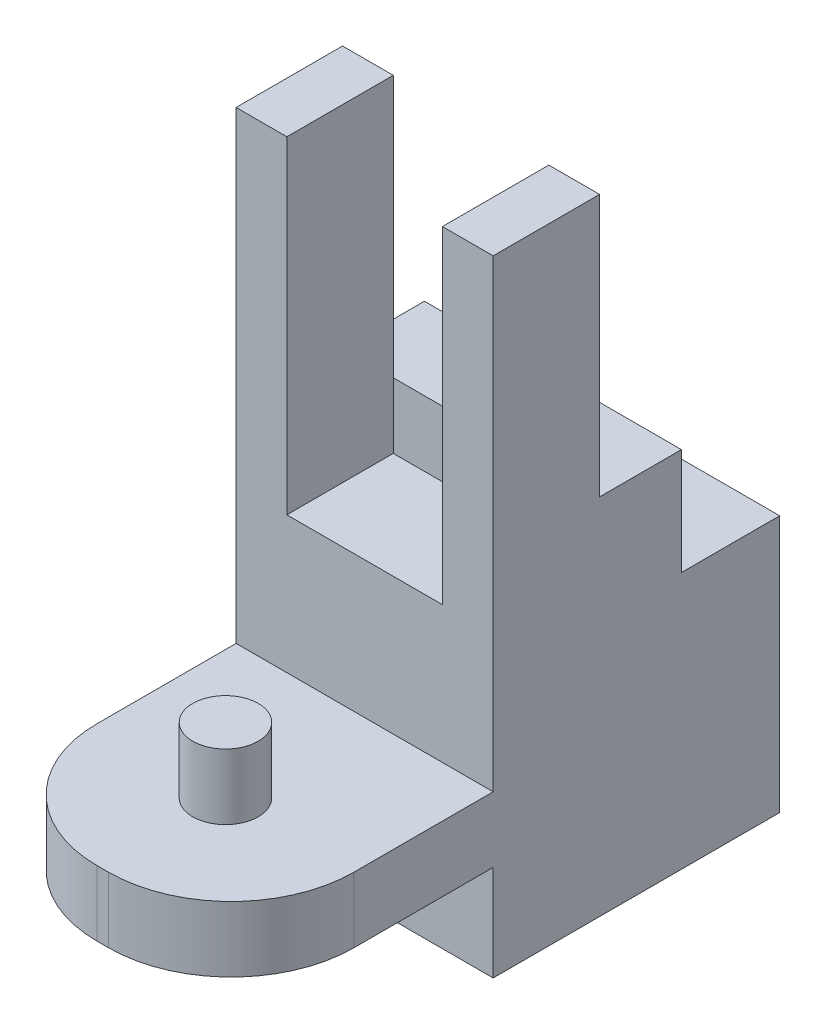
ISO-10303-21;
HEADER;
FILE_DESCRIPTION(('STEP AP214'),'2;1');
FILE_NAME('part.step','',(''),(''),'','','');
FILE_SCHEMA(('AUTOMOTIVE_DESIGN { 1 0 10303 214 1 1 1 1 }'));
ENDSEC;
DATA;
#1=APPLICATION_CONTEXT('core data for automotive mechanical design processes');
#2=APPLICATION_PROTOCOL_DEFINITION('international standard','automotive_design',2000,#1);
#3=PRODUCT_CONTEXT('',#1,'mechanical');
#4=PRODUCT('Part','Part','',(#3));
#5=PRODUCT_RELATED_PRODUCT_CATEGORY('part','',(#4));
#6=PRODUCT_DEFINITION_FORMATION('','',#4);
#7=PRODUCT_DEFINITION_CONTEXT('part definition',#1,'design');
#8=PRODUCT_DEFINITION('design','',#6,#7);
#9=PRODUCT_DEFINITION_SHAPE('','',#8);
#10=(LENGTH_UNIT() NAMED_UNIT(*) SI_UNIT(.MILLI.,.METRE.));
#11=(NAMED_UNIT(*) PLANE_ANGLE_UNIT() SI_UNIT($,.RADIAN.));
#12=(NAMED_UNIT(*) SI_UNIT($,.STERADIAN.) SOLID_ANGLE_UNIT());
#13=UNCERTAINTY_MEASURE_WITH_UNIT(LENGTH_MEASURE(1.E-05),#10,'distance_accuracy_value','');
#14=(GEOMETRIC_REPRESENTATION_CONTEXT(3) GLOBAL_UNCERTAINTY_ASSIGNED_CONTEXT((#13)) GLOBAL_UNIT_ASSIGNED_CONTEXT((#10,
#11,#12)) REPRESENTATION_CONTEXT('',''));
#15=CARTESIAN_POINT('',(0.,0.,0.));
#16=DIRECTION('',(0.,0.,1.));
#17=DIRECTION('',(1.,0.,0.));
#18=AXIS2_PLACEMENT_3D('',#15,#16,#17);
#19=CARTESIAN_POINT('',(0.,20.7,0.));
#20=DIRECTION('',(0.,-1.,0.));
#21=DIRECTION('',(0.,0.,-1.));
#22=AXIS2_PLACEMENT_3D('',#19,#20,#21);
#23=PLANE('',#22);
#24=DIRECTION('',(0.,0.,1.));
#25=VECTOR('',#24,1.);
#26=CARTESIAN_POINT('',(9.50000000000001,20.7,22.));
#27=LINE('',#26,#25);
#28=CARTESIAN_POINT('',(9.50000000000001,20.7,22.));
#29=VERTEX_POINT('',#28);
#30=CARTESIAN_POINT('',(9.50000000000001,20.7,35.));
#31=VERTEX_POINT('',#30);
#32=EDGE_CURVE('E225',#29,#31,#27,.T.);
#33=ORIENTED_EDGE('',*,*,#32,.F.);
#34=DIRECTION('',(-1.,0.,0.));
#35=VECTOR('',#34,1.);
#36=CARTESIAN_POINT('',(-15.7,20.7,22.));
#37=LINE('',#36,#35);
#38=CARTESIAN_POINT('',(-9.49999999999999,20.7,22.));
#39=VERTEX_POINT('',#38);
#40=EDGE_CURVE('E269',#29,#39,#37,.T.);
#41=ORIENTED_EDGE('',*,*,#40,.T.);
#42=DIRECTION('',(0.,0.,-1.));
#43=VECTOR('',#42,1.);
#44=CARTESIAN_POINT('',(-9.49999999999999,20.7,22.));
#45=LINE('',#44,#43);
#46=CARTESIAN_POINT('',(-9.49999999999999,20.7,35.));
#47=VERTEX_POINT('',#46);
#48=EDGE_CURVE('E235',#47,#39,#45,.T.);
#49=ORIENTED_EDGE('',*,*,#48,.F.);
#50=DIRECTION('',(-1.,0.,0.));
#51=VECTOR('',#50,1.);
#52=CARTESIAN_POINT('',(-9.49999999999999,20.7,35.));
#53=LINE('',#52,#51);
#54=EDGE_CURVE('E214',#31,#47,#53,.T.);
#55=ORIENTED_EDGE('',*,*,#54,.F.);
#56=EDGE_LOOP('',(#33,#41,#49,#55));
#57=FACE_BOUND('',#56,.T.);
#58=ADVANCED_FACE('F34',(#57),#23,.F.);
#59=CARTESIAN_POINT('',(15.7,28.7,22.));
#60=DIRECTION('',(0.,0.,-1.));
#61=DIRECTION('',(-1.,0.,0.));
#62=AXIS2_PLACEMENT_3D('',#59,#60,#61);
#63=PLANE('',#62);
#64=DIRECTION('',(0.,-1.,0.));
#65=VECTOR('',#64,1.);
#66=CARTESIAN_POINT('',(9.50000000000001,60.7,22.));
#67=LINE('',#66,#65);
#68=CARTESIAN_POINT('',(9.50000000000001,28.7,22.));
#69=VERTEX_POINT('',#68);
#70=EDGE_CURVE('E231',#69,#29,#67,.T.);
#71=ORIENTED_EDGE('',*,*,#70,.F.);
#72=DIRECTION('',(1.,0.,0.));
#73=VECTOR('',#72,1.);
#74=CARTESIAN_POINT('',(15.7,28.7,22.));
#75=LINE('',#74,#73);
#76=CARTESIAN_POINT('',(-9.49999999999999,28.7,22.));
#77=VERTEX_POINT('',#76);
#78=EDGE_CURVE('E255',#77,#69,#75,.T.);
#79=ORIENTED_EDGE('',*,*,#78,.F.);
#80=DIRECTION('',(0.,-1.,0.));
#81=VECTOR('',#80,1.);
#82=CARTESIAN_POINT('',(-9.49999999999999,60.7,22.));
#83=LINE('',#82,#81);
#84=EDGE_CURVE('E248',#77,#39,#83,.T.);
#85=ORIENTED_EDGE('',*,*,#84,.T.);
#86=ORIENTED_EDGE('',*,*,#40,.F.);
#87=EDGE_LOOP('',(#71,#79,#85,#86));
#88=FACE_BOUND('',#87,.T.);
#89=ADVANCED_FACE('F426',(#88),#63,.F.);
#90=CARTESIAN_POINT('',(-15.7,15.7,30.));
#91=DIRECTION('',(0.,-1.,0.));
#92=DIRECTION('',(0.,0.,-1.));
#93=AXIS2_PLACEMENT_3D('',#90,#91,#92);
#94=PLANE('',#93);
#95=DIRECTION('',(-1.,0.,0.));
#96=VECTOR('',#95,1.);
#97=CARTESIAN_POINT('',(-15.7,15.7,12.));
#98=LINE('',#97,#96);
#99=CARTESIAN_POINT('',(15.7,15.7,12.));
#100=VERTEX_POINT('',#99);
#101=CARTESIAN_POINT('',(-15.7,15.7,12.));
#102=VERTEX_POINT('',#101);
#103=EDGE_CURVE('E250',#100,#102,#98,.T.);
#104=ORIENTED_EDGE('',*,*,#103,.F.);
#105=DIRECTION('',(0.,0.,-1.));
#106=VECTOR('',#105,1.);
#107=CARTESIAN_POINT('',(15.7,15.7,30.));
#108=LINE('',#107,#106);
#109=CARTESIAN_POINT('',(15.7,15.7,0.));
#110=VERTEX_POINT('',#109);
#111=EDGE_CURVE('E375',#100,#110,#108,.T.);
#112=ORIENTED_EDGE('',*,*,#111,.T.);
#113=DIRECTION('',(-1.,0.,0.));
#114=VECTOR('',#113,1.);
#115=CARTESIAN_POINT('',(-15.7,15.7,0.));
#116=LINE('',#115,#114);
#117=CARTESIAN_POINT('',(-15.7,15.7,0.));
#118=VERTEX_POINT('',#117);
#119=EDGE_CURVE('E370',#110,#118,#116,.T.);
#120=ORIENTED_EDGE('',*,*,#119,.T.);
#121=DIRECTION('',(0.,0.,-1.));
#122=VECTOR('',#121,1.);
#123=CARTESIAN_POINT('',(-15.7,15.7,30.));
#124=LINE('',#123,#122);
#125=EDGE_CURVE('E373',#102,#118,#124,.T.);
#126=ORIENTED_EDGE('',*,*,#125,.F.);
#127=EDGE_LOOP('',(#104,#112,#120,#126));
#128=FACE_BOUND('',#127,.T.);
#129=ADVANCED_FACE('F432',(#128),#94,.F.);
#130=CARTESIAN_POINT('',(0.,0.,35.));
#131=DIRECTION('',(0.,0.,-1.));
#132=DIRECTION('',(-1.,0.,0.));
#133=AXIS2_PLACEMENT_3D('',#130,#131,#132);
#134=PLANE('',#133);
#135=DIRECTION('',(-1.,0.,0.));
#136=VECTOR('',#135,1.);
#137=CARTESIAN_POINT('',(-15.7,4.,35.));
#138=LINE('',#137,#136);
#139=CARTESIAN_POINT('',(15.7,4.,35.));
#140=VERTEX_POINT('',#139);
#141=CARTESIAN_POINT('',(-15.7,4.,35.));
#142=VERTEX_POINT('',#141);
#143=EDGE_CURVE('E57',#140,#142,#138,.T.);
#144=ORIENTED_EDGE('',*,*,#143,.F.);
#145=DIRECTION('',(0.,1.,0.));
#146=VECTOR('',#145,1.);
#147=CARTESIAN_POINT('',(15.7,15.7,35.));
#148=LINE('',#147,#146);
#149=CARTESIAN_POINT('',(15.7,60.7,35.));
#150=VERTEX_POINT('',#149);
#151=EDGE_CURVE('E188',#140,#150,#148,.T.);
#152=ORIENTED_EDGE('',*,*,#151,.T.);
#153=DIRECTION('',(-1.,0.,0.));
#154=VECTOR('',#153,1.);
#155=CARTESIAN_POINT('',(9.50000000000001,60.7,35.));
#156=LINE('',#155,#154);
#157=CARTESIAN_POINT('',(9.50000000000001,60.7,35.));
#158=VERTEX_POINT('',#157);
#159=EDGE_CURVE('E193',#150,#158,#156,.T.);
#160=ORIENTED_EDGE('',*,*,#159,.T.);
#161=DIRECTION('',(0.,-1.,0.));
#162=VECTOR('',#161,1.);
#163=CARTESIAN_POINT('',(9.50000000000001,20.7,35.));
#164=LINE('',#163,#162);
#165=EDGE_CURVE('E212',#158,#31,#164,.T.);
#166=ORIENTED_EDGE('',*,*,#165,.T.);
#167=ORIENTED_EDGE('',*,*,#54,.T.);
#168=DIRECTION('',(0.,1.,0.));
#169=VECTOR('',#168,1.);
#170=CARTESIAN_POINT('',(-9.49999999999999,60.7,35.));
#171=LINE('',#170,#169);
#172=CARTESIAN_POINT('',(-9.49999999999999,60.7,35.));
#173=VERTEX_POINT('',#172);
#174=EDGE_CURVE('E219',#47,#173,#171,.T.);
#175=ORIENTED_EDGE('',*,*,#174,.T.);
#176=DIRECTION('',(-1.,0.,0.));
#177=VECTOR('',#176,1.);
#178=CARTESIAN_POINT('',(-15.7,60.7,35.));
#179=LINE('',#178,#177);
#180=CARTESIAN_POINT('',(-15.7,60.7,35.));
#181=VERTEX_POINT('',#180);
#182=EDGE_CURVE('E222',#173,#181,#179,.T.);
#183=ORIENTED_EDGE('',*,*,#182,.T.);
#184=DIRECTION('',(0.,-1.,0.));
#185=VECTOR('',#184,1.);
#186=CARTESIAN_POINT('',(-15.7,-15.7,35.));
#187=LINE('',#186,#185);
#188=EDGE_CURVE('E324',#181,#142,#187,.T.);
#189=ORIENTED_EDGE('',*,*,#188,.T.);
#190=EDGE_LOOP('',(#144,#152,#160,#166,#167,#175,#183,#189));
#191=FACE_BOUND('',#190,.T.);
#192=ADVANCED_FACE('F190',(#191),#134,.F.);
#193=DIRECTION('',(1.,0.,0.));
#194=VECTOR('',#193,1.);
#195=CARTESIAN_POINT('',(15.7,-4.,35.));
#196=LINE('',#195,#194);
#197=CARTESIAN_POINT('',(-15.7,-4.,35.));
#198=VERTEX_POINT('',#197);
#199=CARTESIAN_POINT('',(15.7,-4.,35.));
#200=VERTEX_POINT('',#199);
#201=EDGE_CURVE('E302',#198,#200,#196,.T.);
#202=ORIENTED_EDGE('',*,*,#201,.F.);
#203=CARTESIAN_POINT('',(-15.7,-15.7,35.));
#204=VERTEX_POINT('',#203);
#205=EDGE_CURVE('E323',#198,#204,#187,.T.);
#206=ORIENTED_EDGE('',*,*,#205,.T.);
#207=DIRECTION('',(1.,0.,0.));
#208=VECTOR('',#207,1.);
#209=CARTESIAN_POINT('',(15.7,-15.7,35.));
#210=LINE('',#209,#208);
#211=CARTESIAN_POINT('',(15.7,-15.7,35.));
#212=VERTEX_POINT('',#211);
#213=EDGE_CURVE('E198',#204,#212,#210,.T.);
#214=ORIENTED_EDGE('',*,*,#213,.T.);
#215=EDGE_CURVE('E197',#212,#200,#148,.T.);
#216=ORIENTED_EDGE('',*,*,#215,.T.);
#217=EDGE_LOOP('',(#202,#206,#214,#216));
#218=FACE_BOUND('',#217,.T.);
#219=ADVANCED_FACE('F396',(#218),#134,.F.);
#220=CARTESIAN_POINT('',(0.,0.,0.));
#221=DIRECTION('',(0.,0.,1.));
#222=DIRECTION('',(1.,0.,0.));
#223=AXIS2_PLACEMENT_3D('',#220,#221,#222);
#224=PLANE('',#223);
#225=DIRECTION('',(0.,-1.,0.));
#226=VECTOR('',#225,1.);
#227=CARTESIAN_POINT('',(-15.7,15.7,0.));
#228=LINE('',#227,#226);
#229=CARTESIAN_POINT('',(-15.7,-15.7,0.));
#230=VERTEX_POINT('',#229);
#231=EDGE_CURVE('E362',#118,#230,#228,.T.);
#232=ORIENTED_EDGE('',*,*,#231,.F.);
#233=ORIENTED_EDGE('',*,*,#119,.F.);
#234=DIRECTION('',(0.,1.,0.));
#235=VECTOR('',#234,1.);
#236=CARTESIAN_POINT('',(15.7,15.7,0.));
#237=LINE('',#236,#235);
#238=CARTESIAN_POINT('',(15.7,-15.7,0.));
#239=VERTEX_POINT('',#238);
#240=EDGE_CURVE('E367',#239,#110,#237,.T.);
#241=ORIENTED_EDGE('',*,*,#240,.F.);
#242=DIRECTION('',(1.,0.,0.));
#243=VECTOR('',#242,1.);
#244=CARTESIAN_POINT('',(-15.7,-15.7,0.));
#245=LINE('',#244,#243);
#246=EDGE_CURVE('E365',#230,#239,#245,.T.);
#247=ORIENTED_EDGE('',*,*,#246,.F.);
#248=EDGE_LOOP('',(#232,#233,#241,#247));
#249=FACE_BOUND('',#248,.T.);
#250=DIRECTION('',(-1.,0.,0.));
#251=VECTOR('',#250,1.);
#252=CARTESIAN_POINT('',(-12.7,12.7,0.));
#253=LINE('',#252,#251);
#254=CARTESIAN_POINT('',(12.7,12.7,0.));
#255=VERTEX_POINT('',#254);
#256=CARTESIAN_POINT('',(-12.7,12.7,0.));
#257=VERTEX_POINT('',#256);
#258=EDGE_CURVE('E328',#255,#257,#253,.T.);
#259=ORIENTED_EDGE('',*,*,#258,.T.);
#260=DIRECTION('',(0.,-1.,0.));
#261=VECTOR('',#260,1.);
#262=CARTESIAN_POINT('',(-12.7,12.7,0.));
#263=LINE('',#262,#261);
#264=CARTESIAN_POINT('',(-12.7,-12.7,0.));
#265=VERTEX_POINT('',#264);
#266=EDGE_CURVE('E345',#257,#265,#263,.T.);
#267=ORIENTED_EDGE('',*,*,#266,.T.);
#268=DIRECTION('',(1.,0.,0.));
#269=VECTOR('',#268,1.);
#270=CARTESIAN_POINT('',(-12.7,-12.7,0.));
#271=LINE('',#270,#269);
#272=CARTESIAN_POINT('',(12.7,-12.7,0.));
#273=VERTEX_POINT('',#272);
#274=EDGE_CURVE('E348',#265,#273,#271,.T.);
#275=ORIENTED_EDGE('',*,*,#274,.T.);
#276=DIRECTION('',(0.,1.,0.));
#277=VECTOR('',#276,1.);
#278=CARTESIAN_POINT('',(12.7,12.7,0.));
#279=LINE('',#278,#277);
#280=EDGE_CURVE('E333',#273,#255,#279,.T.);
#281=ORIENTED_EDGE('',*,*,#280,.T.);
#282=EDGE_LOOP('',(#259,#267,#275,#281));
#283=FACE_BOUND('',#282,.T.);
#284=ADVANCED_FACE('F390',(#249,#283),#224,.F.);
#285=CARTESIAN_POINT('',(-15.7,15.7,30.));
#286=DIRECTION('',(1.,0.,0.));
#287=DIRECTION('',(0.,1.,0.));
#288=AXIS2_PLACEMENT_3D('',#285,#286,#287);
#289=PLANE('',#288);
#290=ORIENTED_EDGE('',*,*,#188,.F.);
#291=DIRECTION('',(0.,0.,1.));
#292=VECTOR('',#291,1.);
#293=CARTESIAN_POINT('',(-15.7,60.7,32.));
#294=LINE('',#293,#292);
#295=CARTESIAN_POINT('',(-15.7,60.7,22.));
#296=VERTEX_POINT('',#295);
#297=EDGE_CURVE('E236',#296,#181,#294,.T.);
#298=ORIENTED_EDGE('',*,*,#297,.F.);
#299=DIRECTION('',(0.,-1.,0.));
#300=VECTOR('',#299,1.);
#301=CARTESIAN_POINT('',(-15.7,60.7,22.));
#302=LINE('',#301,#300);
#303=CARTESIAN_POINT('',(-15.7,28.7,22.));
#304=VERTEX_POINT('',#303);
#305=EDGE_CURVE('E243',#296,#304,#302,.T.);
#306=ORIENTED_EDGE('',*,*,#305,.T.);
#307=DIRECTION('',(0.,0.,1.));
#308=VECTOR('',#307,1.);
#309=CARTESIAN_POINT('',(-15.7,28.7,22.));
#310=LINE('',#309,#308);
#311=CARTESIAN_POINT('',(-15.7,28.7,12.));
#312=VERTEX_POINT('',#311);
#313=EDGE_CURVE('E260',#312,#304,#310,.T.);
#314=ORIENTED_EDGE('',*,*,#313,.F.);
#315=DIRECTION('',(0.,-1.,0.));
#316=VECTOR('',#315,1.);
#317=CARTESIAN_POINT('',(-15.7,28.7,12.));
#318=LINE('',#317,#316);
#319=EDGE_CURVE('E263',#312,#102,#318,.T.);
#320=ORIENTED_EDGE('',*,*,#319,.T.);
#321=ORIENTED_EDGE('',*,*,#125,.T.);
#322=ORIENTED_EDGE('',*,*,#231,.T.);
#323=DIRECTION('',(0.,0.,-1.));
#324=VECTOR('',#323,1.);
#325=CARTESIAN_POINT('',(-15.7,-15.7,30.));
#326=LINE('',#325,#324);
#327=EDGE_CURVE('E42',#204,#230,#326,.T.);
#328=ORIENTED_EDGE('',*,*,#327,.F.);
#329=ORIENTED_EDGE('',*,*,#205,.F.);
#330=DIRECTION('',(0.,0.,-1.));
#331=VECTOR('',#330,1.);
#332=CARTESIAN_POINT('',(-15.7,-4.,40.));
#333=LINE('',#332,#331);
#334=CARTESIAN_POINT('',(-15.7,-4.,52.));
#335=VERTEX_POINT('',#334);
#336=EDGE_CURVE('E320',#335,#198,#333,.T.);
#337=ORIENTED_EDGE('',*,*,#336,.F.);
#338=DIRECTION('',(0.,-1.,0.));
#339=VECTOR('',#338,1.);
#340=CARTESIAN_POINT('',(-15.7,4.,52.));
#341=LINE('',#340,#339);
#342=CARTESIAN_POINT('',(-15.7,4.,52.));
#343=VERTEX_POINT('',#342);
#344=EDGE_CURVE('E299',#343,#335,#341,.T.);
#345=ORIENTED_EDGE('',*,*,#344,.F.);
#346=DIRECTION('',(0.,0.,-1.));
#347=VECTOR('',#346,1.);
#348=CARTESIAN_POINT('',(-15.7,4.,40.));
#349=LINE('',#348,#347);
#350=EDGE_CURVE('E312',#343,#142,#349,.T.);
#351=ORIENTED_EDGE('',*,*,#350,.T.);
#352=EDGE_LOOP('',(#290,#298,#306,#314,#320,#321,#322,#328,#329,#337,#345,#351));
#353=FACE_BOUND('',#352,.T.);
#354=ADVANCED_FACE('F36',(#353),#289,.F.);
#355=CARTESIAN_POINT('',(-15.7,-15.7,30.));
#356=DIRECTION('',(0.,1.,0.));
#357=DIRECTION('',(0.,0.,1.));
#358=AXIS2_PLACEMENT_3D('',#355,#356,#357);
#359=PLANE('',#358);
#360=ORIENTED_EDGE('',*,*,#246,.T.);
#361=DIRECTION('',(0.,0.,-1.));
#362=VECTOR('',#361,1.);
#363=CARTESIAN_POINT('',(15.7,-15.7,30.));
#364=LINE('',#363,#362);
#365=EDGE_CURVE('E377',#212,#239,#364,.T.);
#366=ORIENTED_EDGE('',*,*,#365,.F.);
#367=ORIENTED_EDGE('',*,*,#213,.F.);
#368=ORIENTED_EDGE('',*,*,#327,.T.);
#369=EDGE_LOOP('',(#360,#366,#367,#368));
#370=FACE_BOUND('',#369,.T.);
#371=ADVANCED_FACE('F383',(#370),#359,.F.);
#372=CARTESIAN_POINT('',(15.7,15.7,30.));
#373=DIRECTION('',(-1.,0.,0.));
#374=DIRECTION('',(0.,-1.,0.));
#375=AXIS2_PLACEMENT_3D('',#372,#373,#374);
#376=PLANE('',#375);
#377=ORIENTED_EDGE('',*,*,#111,.F.);
#378=DIRECTION('',(0.,-1.,0.));
#379=VECTOR('',#378,1.);
#380=CARTESIAN_POINT('',(15.7,28.7,12.));
#381=LINE('',#380,#379);
#382=CARTESIAN_POINT('',(15.7,28.7,12.));
#383=VERTEX_POINT('',#382);
#384=EDGE_CURVE('E267',#383,#100,#381,.T.);
#385=ORIENTED_EDGE('',*,*,#384,.F.);
#386=DIRECTION('',(0.,0.,-1.));
#387=VECTOR('',#386,1.);
#388=CARTESIAN_POINT('',(15.7,28.7,12.));
#389=LINE('',#388,#387);
#390=CARTESIAN_POINT('',(15.7,28.7,22.));
#391=VERTEX_POINT('',#390);
#392=EDGE_CURVE('E254',#391,#383,#389,.T.);
#393=ORIENTED_EDGE('',*,*,#392,.F.);
#394=DIRECTION('',(0.,-1.,0.));
#395=VECTOR('',#394,1.);
#396=CARTESIAN_POINT('',(15.7,60.7,22.));
#397=LINE('',#396,#395);
#398=CARTESIAN_POINT('',(15.7,60.7,22.));
#399=VERTEX_POINT('',#398);
#400=EDGE_CURVE('E205',#399,#391,#397,.T.);
#401=ORIENTED_EDGE('',*,*,#400,.F.);
#402=DIRECTION('',(0.,0.,-1.));
#403=VECTOR('',#402,1.);
#404=CARTESIAN_POINT('',(15.7,60.7,32.));
#405=LINE('',#404,#403);
#406=EDGE_CURVE('E201',#150,#399,#405,.T.);
#407=ORIENTED_EDGE('',*,*,#406,.F.);
#408=ORIENTED_EDGE('',*,*,#151,.F.);
#409=DIRECTION('',(0.,0.,-1.));
#410=VECTOR('',#409,1.);
#411=CARTESIAN_POINT('',(15.7,4.,40.));
#412=LINE('',#411,#410);
#413=CARTESIAN_POINT('',(15.7,4.,52.));
#414=VERTEX_POINT('',#413);
#415=EDGE_CURVE('E315',#414,#140,#412,.T.);
#416=ORIENTED_EDGE('',*,*,#415,.F.);
#417=DIRECTION('',(0.,-1.,0.));
#418=VECTOR('',#417,1.);
#419=CARTESIAN_POINT('',(15.7,4.,52.));
#420=LINE('',#419,#418);
#421=CARTESIAN_POINT('',(15.7,-4.,52.));
#422=VERTEX_POINT('',#421);
#423=EDGE_CURVE('E291',#414,#422,#420,.T.);
#424=ORIENTED_EDGE('',*,*,#423,.T.);
#425=DIRECTION('',(0.,0.,-1.));
#426=VECTOR('',#425,1.);
#427=CARTESIAN_POINT('',(15.7,-4.,40.));
#428=LINE('',#427,#426);
#429=EDGE_CURVE('E317',#422,#200,#428,.T.);
#430=ORIENTED_EDGE('',*,*,#429,.T.);
#431=ORIENTED_EDGE('',*,*,#215,.F.);
#432=ORIENTED_EDGE('',*,*,#365,.T.);
#433=ORIENTED_EDGE('',*,*,#240,.T.);
#434=EDGE_LOOP('',(#377,#385,#393,#401,#407,#408,#416,#424,#430,#431,#432,#433));
#435=FACE_BOUND('',#434,.T.);
#436=ADVANCED_FACE('F203',(#435),#376,.F.);
#437=CARTESIAN_POINT('',(-12.7,12.7,30.));
#438=DIRECTION('',(0.,-1.,0.));
#439=DIRECTION('',(0.,0.,-1.));
#440=AXIS2_PLACEMENT_3D('',#437,#438,#439);
#441=PLANE('',#440);
#442=ORIENTED_EDGE('',*,*,#258,.F.);
#443=DIRECTION('',(0.,0.,-1.));
#444=VECTOR('',#443,1.);
#445=CARTESIAN_POINT('',(12.7,12.7,30.));
#446=LINE('',#445,#444);
#447=CARTESIAN_POINT('',(12.7,12.7,30.));
#448=VERTEX_POINT('',#447);
#449=EDGE_CURVE('E342',#448,#255,#446,.T.);
#450=ORIENTED_EDGE('',*,*,#449,.F.);
#451=DIRECTION('',(-1.,0.,0.));
#452=VECTOR('',#451,1.);
#453=CARTESIAN_POINT('',(-12.7,12.7,30.));
#454=LINE('',#453,#452);
#455=CARTESIAN_POINT('',(-12.7,12.7,30.));
#456=VERTEX_POINT('',#455);
#457=EDGE_CURVE('E329',#448,#456,#454,.T.);
#458=ORIENTED_EDGE('',*,*,#457,.T.);
#459=DIRECTION('',(0.,0.,-1.));
#460=VECTOR('',#459,1.);
#461=CARTESIAN_POINT('',(-12.7,12.7,30.));
#462=LINE('',#461,#460);
#463=EDGE_CURVE('E359',#456,#257,#462,.T.);
#464=ORIENTED_EDGE('',*,*,#463,.T.);
#465=EDGE_LOOP('',(#442,#450,#458,#464));
#466=FACE_BOUND('',#465,.T.);
#467=ADVANCED_FACE('F484',(#466),#441,.T.);
#468=CARTESIAN_POINT('',(-12.7,12.7,30.));
#469=DIRECTION('',(1.,0.,0.));
#470=DIRECTION('',(0.,1.,0.));
#471=AXIS2_PLACEMENT_3D('',#468,#469,#470);
#472=PLANE('',#471);
#473=ORIENTED_EDGE('',*,*,#266,.F.);
#474=ORIENTED_EDGE('',*,*,#463,.F.);
#475=DIRECTION('',(0.,-1.,0.));
#476=VECTOR('',#475,1.);
#477=CARTESIAN_POINT('',(-12.7,12.7,30.));
#478=LINE('',#477,#476);
#479=CARTESIAN_POINT('',(-12.7,-12.7,30.));
#480=VERTEX_POINT('',#479);
#481=EDGE_CURVE('E332',#456,#480,#478,.T.);
#482=ORIENTED_EDGE('',*,*,#481,.T.);
#483=DIRECTION('',(0.,0.,-1.));
#484=VECTOR('',#483,1.);
#485=CARTESIAN_POINT('',(-12.7,-12.7,30.));
#486=LINE('',#485,#484);
#487=EDGE_CURVE('E357',#480,#265,#486,.T.);
#488=ORIENTED_EDGE('',*,*,#487,.T.);
#489=EDGE_LOOP('',(#473,#474,#482,#488));
#490=FACE_BOUND('',#489,.T.);
#491=ADVANCED_FACE('F480',(#490),#472,.T.);
#492=CARTESIAN_POINT('',(-12.7,-12.7,30.));
#493=DIRECTION('',(0.,1.,0.));
#494=DIRECTION('',(0.,0.,1.));
#495=AXIS2_PLACEMENT_3D('',#492,#493,#494);
#496=PLANE('',#495);
#497=ORIENTED_EDGE('',*,*,#274,.F.);
#498=ORIENTED_EDGE('',*,*,#487,.F.);
#499=DIRECTION('',(1.,0.,0.));
#500=VECTOR('',#499,1.);
#501=CARTESIAN_POINT('',(-12.7,-12.7,30.));
#502=LINE('',#501,#500);
#503=CARTESIAN_POINT('',(12.7,-12.7,30.));
#504=VERTEX_POINT('',#503);
#505=EDGE_CURVE('E336',#480,#504,#502,.T.);
#506=ORIENTED_EDGE('',*,*,#505,.T.);
#507=DIRECTION('',(0.,0.,-1.));
#508=VECTOR('',#507,1.);
#509=CARTESIAN_POINT('',(12.7,-12.7,30.));
#510=LINE('',#509,#508);
#511=EDGE_CURVE('E355',#504,#273,#510,.T.);
#512=ORIENTED_EDGE('',*,*,#511,.T.);
#513=EDGE_LOOP('',(#497,#498,#506,#512));
#514=FACE_BOUND('',#513,.T.);
#515=ADVANCED_FACE('F476',(#514),#496,.T.);
#516=CARTESIAN_POINT('',(12.7,12.7,30.));
#517=DIRECTION('',(-1.,0.,0.));
#518=DIRECTION('',(0.,-1.,0.));
#519=AXIS2_PLACEMENT_3D('',#516,#517,#518);
#520=PLANE('',#519);
#521=ORIENTED_EDGE('',*,*,#280,.F.);
#522=ORIENTED_EDGE('',*,*,#511,.F.);
#523=DIRECTION('',(0.,1.,0.));
#524=VECTOR('',#523,1.);
#525=CARTESIAN_POINT('',(12.7,12.7,30.));
#526=LINE('',#525,#524);
#527=EDGE_CURVE('E339',#504,#448,#526,.T.);
#528=ORIENTED_EDGE('',*,*,#527,.T.);
#529=ORIENTED_EDGE('',*,*,#449,.T.);
#530=EDGE_LOOP('',(#521,#522,#528,#529));
#531=FACE_BOUND('',#530,.T.);
#532=ADVANCED_FACE('F468',(#531),#520,.T.);
#533=CARTESIAN_POINT('',(0.,0.,30.));
#534=DIRECTION('',(0.,0.,-1.));
#535=DIRECTION('',(-1.,0.,0.));
#536=AXIS2_PLACEMENT_3D('',#533,#534,#535);
#537=PLANE('',#536);
#538=ORIENTED_EDGE('',*,*,#481,.F.);
#539=ORIENTED_EDGE('',*,*,#457,.F.);
#540=ORIENTED_EDGE('',*,*,#527,.F.);
#541=ORIENTED_EDGE('',*,*,#505,.F.);
#542=EDGE_LOOP('',(#538,#539,#540,#541));
#543=FACE_BOUND('',#542,.T.);
#544=ADVANCED_FACE('F460',(#543),#537,.T.);
#545=CARTESIAN_POINT('',(15.7,-4.,40.));
#546=DIRECTION('',(0.,1.,0.));
#547=DIRECTION('',(-1.,0.,0.));
#548=AXIS2_PLACEMENT_3D('',#545,#546,#547);
#549=PLANE('',#548);
#550=CARTESIAN_POINT('',(0.,-4.,52.));
#551=DIRECTION('',(0.,1.,0.));
#552=DIRECTION('',(-1.,0.,0.));
#553=AXIS2_PLACEMENT_3D('',#550,#551,#552);
#554=CIRCLE('',#553,4.);
#555=CARTESIAN_POINT('',(-4.,-4.,52.));
#556=VERTEX_POINT('',#555);
#557=EDGE_CURVE('E11',#556,#556,#554,.F.);
#558=ORIENTED_EDGE('',*,*,#557,.F.);
#559=EDGE_LOOP('',(#558));
#560=FACE_BOUND('',#559,.T.);
#561=ORIENTED_EDGE('',*,*,#201,.T.);
#562=ORIENTED_EDGE('',*,*,#429,.F.);
#563=CARTESIAN_POINT('',(0.699999999999999,-4.,52.));
#564=DIRECTION('',(0.,-1.,0.));
#565=DIRECTION('',(-1.,0.,0.));
#566=AXIS2_PLACEMENT_3D('',#563,#564,#565);
#567=CIRCLE('',#566,15.);
#568=CARTESIAN_POINT('',(0.699999999999999,-4.,67.));
#569=VERTEX_POINT('',#568);
#570=EDGE_CURVE('E280',#422,#569,#567,.T.);
#571=ORIENTED_EDGE('',*,*,#570,.T.);
#572=DIRECTION('',(-1.,0.,0.));
#573=VECTOR('',#572,1.);
#574=CARTESIAN_POINT('',(-0.699999999999992,-4.,67.));
#575=LINE('',#574,#573);
#576=CARTESIAN_POINT('',(-0.699999999999993,-4.,67.));
#577=VERTEX_POINT('',#576);
#578=EDGE_CURVE('E294',#569,#577,#575,.T.);
#579=ORIENTED_EDGE('',*,*,#578,.T.);
#580=CARTESIAN_POINT('',(-0.699999999999992,-4.,52.));
#581=DIRECTION('',(0.,-1.,0.));
#582=DIRECTION('',(-1.,0.,0.));
#583=AXIS2_PLACEMENT_3D('',#580,#581,#582);
#584=CIRCLE('',#583,15.);
#585=EDGE_CURVE('E285',#577,#335,#584,.T.);
#586=ORIENTED_EDGE('',*,*,#585,.T.);
#587=ORIENTED_EDGE('',*,*,#336,.T.);
#588=EDGE_LOOP('',(#561,#562,#571,#579,#586,#587));
#589=FACE_BOUND('',#588,.T.);
#590=ADVANCED_FACE('F399',(#560,#589),#549,.F.);
#591=CARTESIAN_POINT('',(-15.7,4.,40.));
#592=DIRECTION('',(0.,-1.,0.));
#593=DIRECTION('',(0.,0.,-1.));
#594=AXIS2_PLACEMENT_3D('',#591,#592,#593);
#595=PLANE('',#594);
#596=CARTESIAN_POINT('',(0.,4.,52.));
#597=DIRECTION('',(0.,-1.,0.));
#598=DIRECTION('',(1.,0.,0.));
#599=AXIS2_PLACEMENT_3D('',#596,#597,#598);
#600=CIRCLE('',#599,4.);
#601=CARTESIAN_POINT('',(4.00000000000001,4.,52.));
#602=VERTEX_POINT('',#601);
#603=EDGE_CURVE('E271',#602,#602,#600,.T.);
#604=ORIENTED_EDGE('',*,*,#603,.T.);
#605=EDGE_LOOP('',(#604));
#606=FACE_BOUND('',#605,.T.);
#607=ORIENTED_EDGE('',*,*,#143,.T.);
#608=ORIENTED_EDGE('',*,*,#350,.F.);
#609=CARTESIAN_POINT('',(-0.699999999999993,4.,52.));
#610=DIRECTION('',(0.,-1.,0.));
#611=DIRECTION('',(-1.,0.,0.));
#612=AXIS2_PLACEMENT_3D('',#609,#610,#611);
#613=CIRCLE('',#612,15.);
#614=CARTESIAN_POINT('',(-0.699999999999994,4.,67.));
#615=VERTEX_POINT('',#614);
#616=EDGE_CURVE('E288',#615,#343,#613,.T.);
#617=ORIENTED_EDGE('',*,*,#616,.F.);
#618=DIRECTION('',(-1.,0.,0.));
#619=VECTOR('',#618,1.);
#620=CARTESIAN_POINT('',(-0.699999999999993,4.,67.));
#621=LINE('',#620,#619);
#622=CARTESIAN_POINT('',(0.699999999999998,4.,67.));
#623=VERTEX_POINT('',#622);
#624=EDGE_CURVE('E284',#623,#615,#621,.T.);
#625=ORIENTED_EDGE('',*,*,#624,.F.);
#626=CARTESIAN_POINT('',(0.699999999999998,4.,52.));
#627=DIRECTION('',(0.,-1.,0.));
#628=DIRECTION('',(-1.,0.,0.));
#629=AXIS2_PLACEMENT_3D('',#626,#627,#628);
#630=CIRCLE('',#629,15.);
#631=EDGE_CURVE('E281',#414,#623,#630,.T.);
#632=ORIENTED_EDGE('',*,*,#631,.F.);
#633=ORIENTED_EDGE('',*,*,#415,.T.);
#634=EDGE_LOOP('',(#607,#608,#617,#625,#632,#633));
#635=FACE_BOUND('',#634,.T.);
#636=ADVANCED_FACE('F407',(#606,#635),#595,.F.);
#637=CARTESIAN_POINT('',(-0.699999999999993,4.,52.));
#638=DIRECTION('',(0.,-1.,0.));
#639=DIRECTION('',(1.,0.,0.));
#640=AXIS2_PLACEMENT_3D('',#637,#638,#639);
#641=CYLINDRICAL_SURFACE('',#640,15.);
#642=ORIENTED_EDGE('',*,*,#585,.F.);
#643=DIRECTION('',(0.,-1.,0.));
#644=VECTOR('',#643,1.);
#645=CARTESIAN_POINT('',(-0.699999999999994,4.,67.));
#646=LINE('',#645,#644);
#647=EDGE_CURVE('E303',#615,#577,#646,.T.);
#648=ORIENTED_EDGE('',*,*,#647,.F.);
#649=ORIENTED_EDGE('',*,*,#616,.T.);
#650=ORIENTED_EDGE('',*,*,#344,.T.);
#651=EDGE_LOOP('',(#642,#648,#649,#650));
#652=FACE_BOUND('',#651,.T.);
#653=ADVANCED_FACE('F403',(#652),#641,.T.);
#654=CARTESIAN_POINT('',(-0.699999999999993,4.,67.));
#655=DIRECTION('',(0.,0.,1.));
#656=DIRECTION('',(1.,0.,0.));
#657=AXIS2_PLACEMENT_3D('',#654,#655,#656);
#658=PLANE('',#657);
#659=ORIENTED_EDGE('',*,*,#578,.F.);
#660=DIRECTION('',(0.,-1.,0.));
#661=VECTOR('',#660,1.);
#662=CARTESIAN_POINT('',(0.699999999999998,4.,67.));
#663=LINE('',#662,#661);
#664=EDGE_CURVE('E305',#623,#569,#663,.T.);
#665=ORIENTED_EDGE('',*,*,#664,.F.);
#666=ORIENTED_EDGE('',*,*,#624,.T.);
#667=ORIENTED_EDGE('',*,*,#647,.T.);
#668=EDGE_LOOP('',(#659,#665,#666,#667));
#669=FACE_BOUND('',#668,.T.);
#670=ADVANCED_FACE('F415',(#669),#658,.T.);
#671=CARTESIAN_POINT('',(0.699999999999998,4.,52.));
#672=DIRECTION('',(0.,-1.,0.));
#673=DIRECTION('',(1.,0.,0.));
#674=AXIS2_PLACEMENT_3D('',#671,#672,#673);
#675=CYLINDRICAL_SURFACE('',#674,15.);
#676=ORIENTED_EDGE('',*,*,#570,.F.);
#677=ORIENTED_EDGE('',*,*,#423,.F.);
#678=ORIENTED_EDGE('',*,*,#631,.T.);
#679=ORIENTED_EDGE('',*,*,#664,.T.);
#680=EDGE_LOOP('',(#676,#677,#678,#679));
#681=FACE_BOUND('',#680,.T.);
#682=ADVANCED_FACE('F413',(#681),#675,.T.);
#683=CARTESIAN_POINT('',(0.,-12.,52.));
#684=DIRECTION('',(0.,1.,0.));
#685=DIRECTION('',(-1.,0.,0.));
#686=AXIS2_PLACEMENT_3D('',#683,#684,#685);
#687=CYLINDRICAL_SURFACE('',#686,4.);
#688=CARTESIAN_POINT('',(0.,-12.,52.));
#689=DIRECTION('',(0.,-1.,0.));
#690=DIRECTION('',(1.,0.,0.));
#691=AXIS2_PLACEMENT_3D('',#688,#689,#690);
#692=CIRCLE('',#691,4.);
#693=CARTESIAN_POINT('',(4.00000000000001,-12.,52.));
#694=VERTEX_POINT('',#693);
#695=EDGE_CURVE('E275',#694,#694,#692,.T.);
#696=ORIENTED_EDGE('',*,*,#695,.F.);
#697=EDGE_LOOP('',(#696));
#698=FACE_BOUND('',#697,.T.);
#699=ORIENTED_EDGE('',*,*,#557,.T.);
#700=EDGE_LOOP('',(#699));
#701=FACE_BOUND('',#700,.T.);
#702=ADVANCED_FACE('F422',(#698,#701),#687,.T.);
#703=CARTESIAN_POINT('',(0.,-12.,52.));
#704=DIRECTION('',(0.,-1.,0.));
#705=DIRECTION('',(1.,0.,0.));
#706=AXIS2_PLACEMENT_3D('',#703,#704,#705);
#707=PLANE('',#706);
#708=ORIENTED_EDGE('',*,*,#695,.T.);
#709=EDGE_LOOP('',(#708));
#710=FACE_BOUND('',#709,.T.);
#711=ADVANCED_FACE('F446',(#710),#707,.T.);
#712=CARTESIAN_POINT('',(0.,12.,52.));
#713=DIRECTION('',(0.,-1.,0.));
#714=DIRECTION('',(1.,0.,0.));
#715=AXIS2_PLACEMENT_3D('',#712,#713,#714);
#716=CYLINDRICAL_SURFACE('',#715,4.);
#717=CARTESIAN_POINT('',(0.,12.,52.));
#718=DIRECTION('',(0.,-1.,0.));
#719=DIRECTION('',(1.,0.,0.));
#720=AXIS2_PLACEMENT_3D('',#717,#718,#719);
#721=CIRCLE('',#720,4.);
#722=CARTESIAN_POINT('',(4.00000000000001,12.,52.));
#723=VERTEX_POINT('',#722);
#724=EDGE_CURVE('E272',#723,#723,#721,.T.);
#725=ORIENTED_EDGE('',*,*,#724,.T.);
#726=EDGE_LOOP('',(#725));
#727=FACE_BOUND('',#726,.T.);
#728=ORIENTED_EDGE('',*,*,#603,.F.);
#729=EDGE_LOOP('',(#728));
#730=FACE_BOUND('',#729,.T.);
#731=ADVANCED_FACE('F442',(#727,#730),#716,.T.);
#732=CARTESIAN_POINT('',(0.,12.,52.));
#733=DIRECTION('',(0.,1.,0.));
#734=DIRECTION('',(1.,0.,0.));
#735=AXIS2_PLACEMENT_3D('',#732,#733,#734);
#736=PLANE('',#735);
#737=ORIENTED_EDGE('',*,*,#724,.F.);
#738=EDGE_LOOP('',(#737));
#739=FACE_BOUND('',#738,.T.);
#740=ADVANCED_FACE('F438',(#739),#736,.T.);
#741=CARTESIAN_POINT('',(-15.7,28.7,12.));
#742=DIRECTION('',(0.,0.,1.));
#743=DIRECTION('',(1.,0.,0.));
#744=AXIS2_PLACEMENT_3D('',#741,#742,#743);
#745=PLANE('',#744);
#746=ORIENTED_EDGE('',*,*,#103,.T.);
#747=ORIENTED_EDGE('',*,*,#319,.F.);
#748=DIRECTION('',(-1.,0.,0.));
#749=VECTOR('',#748,1.);
#750=CARTESIAN_POINT('',(-15.7,28.7,12.));
#751=LINE('',#750,#749);
#752=EDGE_CURVE('E258',#383,#312,#751,.T.);
#753=ORIENTED_EDGE('',*,*,#752,.F.);
#754=ORIENTED_EDGE('',*,*,#384,.T.);
#755=EDGE_LOOP('',(#746,#747,#753,#754));
#756=FACE_BOUND('',#755,.T.);
#757=ADVANCED_FACE('F441',(#756),#745,.F.);
#758=CARTESIAN_POINT('',(0.,28.7,0.));
#759=DIRECTION('',(0.,-1.,0.));
#760=DIRECTION('',(0.,0.,-1.));
#761=AXIS2_PLACEMENT_3D('',#758,#759,#760);
#762=PLANE('',#761);
#763=EDGE_CURVE('E251',#304,#77,#75,.T.);
#764=ORIENTED_EDGE('',*,*,#763,.T.);
#765=ORIENTED_EDGE('',*,*,#78,.T.);
#766=EDGE_CURVE('E256',#69,#391,#75,.T.);
#767=ORIENTED_EDGE('',*,*,#766,.T.);
#768=ORIENTED_EDGE('',*,*,#392,.T.);
#769=ORIENTED_EDGE('',*,*,#752,.T.);
#770=ORIENTED_EDGE('',*,*,#313,.T.);
#771=EDGE_LOOP('',(#764,#765,#767,#768,#769,#770));
#772=FACE_BOUND('',#771,.T.);
#773=ADVANCED_FACE('F537',(#772),#762,.F.);
#774=CARTESIAN_POINT('',(-15.7,60.7,22.));
#775=DIRECTION('',(0.,0.,1.));
#776=DIRECTION('',(1.,0.,0.));
#777=AXIS2_PLACEMENT_3D('',#774,#775,#776);
#778=PLANE('',#777);
#779=CARTESIAN_POINT('',(-9.49999999999999,60.7,22.));
#780=VERTEX_POINT('',#779);
#781=EDGE_CURVE('E49',#780,#77,#83,.T.);
#782=ORIENTED_EDGE('',*,*,#781,.T.);
#783=ORIENTED_EDGE('',*,*,#763,.F.);
#784=ORIENTED_EDGE('',*,*,#305,.F.);
#785=DIRECTION('',(-1.,0.,0.));
#786=VECTOR('',#785,1.);
#787=CARTESIAN_POINT('',(-15.7,60.7,22.));
#788=LINE('',#787,#786);
#789=EDGE_CURVE('E241',#780,#296,#788,.T.);
#790=ORIENTED_EDGE('',*,*,#789,.F.);
#791=EDGE_LOOP('',(#782,#783,#784,#790));
#792=FACE_BOUND('',#791,.T.);
#793=ADVANCED_FACE('F541',(#792),#778,.F.);
#794=CARTESIAN_POINT('',(-9.49999999999999,60.7,22.));
#795=DIRECTION('',(-1.,0.,0.));
#796=DIRECTION('',(0.,0.,1.));
#797=AXIS2_PLACEMENT_3D('',#794,#795,#796);
#798=PLANE('',#797);
#799=ORIENTED_EDGE('',*,*,#48,.T.);
#800=ORIENTED_EDGE('',*,*,#84,.F.);
#801=ORIENTED_EDGE('',*,*,#781,.F.);
#802=DIRECTION('',(0.,0.,-1.));
#803=VECTOR('',#802,1.);
#804=CARTESIAN_POINT('',(-9.49999999999999,60.7,22.));
#805=LINE('',#804,#803);
#806=EDGE_CURVE('E239',#173,#780,#805,.T.);
#807=ORIENTED_EDGE('',*,*,#806,.F.);
#808=ORIENTED_EDGE('',*,*,#174,.F.);
#809=EDGE_LOOP('',(#799,#800,#801,#807,#808));
#810=FACE_BOUND('',#809,.T.);
#811=ADVANCED_FACE('F551',(#810),#798,.F.);
#812=CARTESIAN_POINT('',(0.,60.7,0.));
#813=DIRECTION('',(0.,-1.,0.));
#814=DIRECTION('',(0.,0.,-1.));
#815=AXIS2_PLACEMENT_3D('',#812,#813,#814);
#816=PLANE('',#815);
#817=ORIENTED_EDGE('',*,*,#297,.T.);
#818=ORIENTED_EDGE('',*,*,#182,.F.);
#819=ORIENTED_EDGE('',*,*,#806,.T.);
#820=ORIENTED_EDGE('',*,*,#789,.T.);
#821=EDGE_LOOP('',(#817,#818,#819,#820));
#822=FACE_BOUND('',#821,.T.);
#823=ADVANCED_FACE('F564',(#822),#816,.F.);
#824=CARTESIAN_POINT('',(15.7,60.7,22.));
#825=DIRECTION('',(0.,0.,1.));
#826=DIRECTION('',(1.,0.,0.));
#827=AXIS2_PLACEMENT_3D('',#824,#825,#826);
#828=PLANE('',#827);
#829=ORIENTED_EDGE('',*,*,#400,.T.);
#830=ORIENTED_EDGE('',*,*,#766,.F.);
#831=CARTESIAN_POINT('',(9.50000000000001,60.7,22.));
#832=VERTEX_POINT('',#831);
#833=EDGE_CURVE('E232',#832,#69,#67,.T.);
#834=ORIENTED_EDGE('',*,*,#833,.F.);
#835=DIRECTION('',(-1.,0.,0.));
#836=VECTOR('',#835,1.);
#837=CARTESIAN_POINT('',(15.7,60.7,22.));
#838=LINE('',#837,#836);
#839=EDGE_CURVE('E226',#399,#832,#838,.T.);
#840=ORIENTED_EDGE('',*,*,#839,.F.);
#841=EDGE_LOOP('',(#829,#830,#834,#840));
#842=FACE_BOUND('',#841,.T.);
#843=ADVANCED_FACE('F559',(#842),#828,.F.);
#844=CARTESIAN_POINT('',(9.50000000000001,60.7,22.));
#845=DIRECTION('',(1.,0.,0.));
#846=DIRECTION('',(0.,0.,-1.));
#847=AXIS2_PLACEMENT_3D('',#844,#845,#846);
#848=PLANE('',#847);
#849=ORIENTED_EDGE('',*,*,#32,.T.);
#850=ORIENTED_EDGE('',*,*,#165,.F.);
#851=DIRECTION('',(0.,0.,1.));
#852=VECTOR('',#851,1.);
#853=CARTESIAN_POINT('',(9.50000000000001,60.7,22.));
#854=LINE('',#853,#852);
#855=EDGE_CURVE('E209',#832,#158,#854,.T.);
#856=ORIENTED_EDGE('',*,*,#855,.F.);
#857=ORIENTED_EDGE('',*,*,#833,.T.);
#858=ORIENTED_EDGE('',*,*,#70,.T.);
#859=EDGE_LOOP('',(#849,#850,#856,#857,#858));
#860=FACE_BOUND('',#859,.T.);
#861=ADVANCED_FACE('F563',(#860),#848,.F.);
#862=CARTESIAN_POINT('',(0.,60.7,0.));
#863=DIRECTION('',(0.,1.,0.));
#864=DIRECTION('',(0.,0.,1.));
#865=AXIS2_PLACEMENT_3D('',#862,#863,#864);
#866=PLANE('',#865);
#867=ORIENTED_EDGE('',*,*,#839,.T.);
#868=ORIENTED_EDGE('',*,*,#855,.T.);
#869=ORIENTED_EDGE('',*,*,#159,.F.);
#870=ORIENTED_EDGE('',*,*,#406,.T.);
#871=EDGE_LOOP('',(#867,#868,#869,#870));
#872=FACE_BOUND('',#871,.T.);
#873=ADVANCED_FACE('F211',(#872),#866,.T.);
#874=CLOSED_SHELL('',(#58,#89,#129,#192,#219,#284,#354,#371,#436,#467,#491,#515,#532,#544,#590,
#636,#653,#670,#682,#702,#711,#731,#740,#757,#773,#793,#811,#823,#843,#861,#873));
#875=MANIFOLD_SOLID_BREP('B2',#874);
#876=ADVANCED_BREP_SHAPE_REPRESENTATION('',(#18,#875),#14);
#877=SHAPE_DEFINITION_REPRESENTATION(#9,#876);
ENDSEC;
END-ISO-10303-21;
